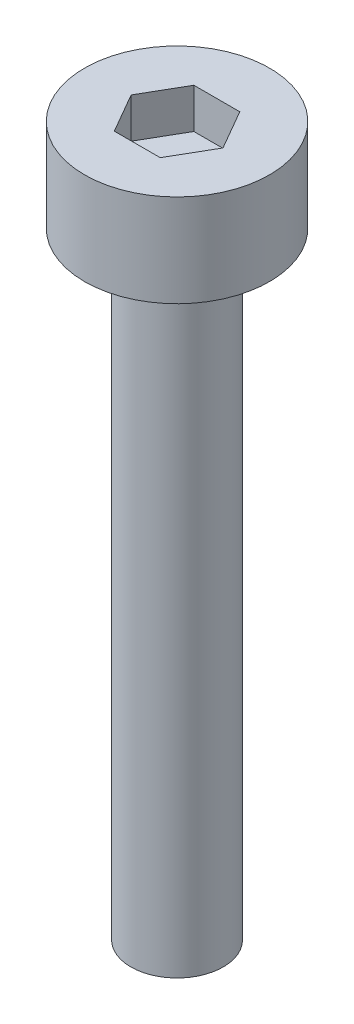
ISO-10303-21;
HEADER;
FILE_DESCRIPTION(('STEP AP214'),'2;1');
FILE_NAME('part.step','',(''),(''),'','','');
FILE_SCHEMA(('AUTOMOTIVE_DESIGN { 1 0 10303 214 1 1 1 1 }'));
ENDSEC;
DATA;
#1=APPLICATION_CONTEXT('core data for automotive mechanical design processes');
#2=APPLICATION_PROTOCOL_DEFINITION('international standard','automotive_design',2000,#1);
#3=PRODUCT_CONTEXT('',#1,'mechanical');
#4=PRODUCT('Part','Part','',(#3));
#5=PRODUCT_RELATED_PRODUCT_CATEGORY('part','',(#4));
#6=PRODUCT_DEFINITION_FORMATION('','',#4);
#7=PRODUCT_DEFINITION_CONTEXT('part definition',#1,'design');
#8=PRODUCT_DEFINITION('design','',#6,#7);
#9=PRODUCT_DEFINITION_SHAPE('','',#8);
#10=(LENGTH_UNIT() NAMED_UNIT(*) SI_UNIT(.MILLI.,.METRE.));
#11=(NAMED_UNIT(*) PLANE_ANGLE_UNIT() SI_UNIT($,.RADIAN.));
#12=(NAMED_UNIT(*) SI_UNIT($,.STERADIAN.) SOLID_ANGLE_UNIT());
#13=UNCERTAINTY_MEASURE_WITH_UNIT(LENGTH_MEASURE(1.E-05),#10,'distance_accuracy_value','');
#14=(GEOMETRIC_REPRESENTATION_CONTEXT(3) GLOBAL_UNCERTAINTY_ASSIGNED_CONTEXT((#13)) GLOBAL_UNIT_ASSIGNED_CONTEXT((#10,
#11,#12)) REPRESENTATION_CONTEXT('',''));
#15=CARTESIAN_POINT('',(0.,0.,0.));
#16=DIRECTION('',(0.,0.,1.));
#17=DIRECTION('',(1.,0.,0.));
#18=AXIS2_PLACEMENT_3D('',#15,#16,#17);
#19=CARTESIAN_POINT('',(0.,20.,0.));
#20=DIRECTION('',(0.,-1.,0.));
#21=DIRECTION('',(0.,0.,-1.));
#22=AXIS2_PLACEMENT_3D('',#19,#20,#21);
#23=CYLINDRICAL_SURFACE('',#22,1.5);
#24=CARTESIAN_POINT('',(0.,20.,0.));
#25=DIRECTION('',(0.,1.,0.));
#26=DIRECTION('',(0.,0.,1.));
#27=AXIS2_PLACEMENT_3D('',#24,#25,#26);
#28=CIRCLE('',#27,1.5);
#29=CARTESIAN_POINT('',(0.,20.,1.5));
#30=VERTEX_POINT('',#29);
#31=EDGE_CURVE('E11',#30,#30,#28,.T.);
#32=ORIENTED_EDGE('',*,*,#31,.F.);
#33=EDGE_LOOP('',(#32));
#34=FACE_BOUND('',#33,.T.);
#35=CARTESIAN_POINT('',(0.,0.,0.));
#36=DIRECTION('',(0.,1.,0.));
#37=DIRECTION('',(0.,0.,1.));
#38=AXIS2_PLACEMENT_3D('',#35,#36,#37);
#39=CIRCLE('',#38,1.5);
#40=CARTESIAN_POINT('',(0.,0.,1.5));
#41=VERTEX_POINT('',#40);
#42=EDGE_CURVE('E36',#41,#41,#39,.T.);
#43=ORIENTED_EDGE('',*,*,#42,.T.);
#44=EDGE_LOOP('',(#43));
#45=FACE_BOUND('',#44,.T.);
#46=ADVANCED_FACE('F33',(#34,#45),#23,.T.);
#47=CARTESIAN_POINT('',(0.,0.,0.));
#48=DIRECTION('',(0.,1.,0.));
#49=DIRECTION('',(0.,0.,1.));
#50=AXIS2_PLACEMENT_3D('',#47,#48,#49);
#51=PLANE('',#50);
#52=ORIENTED_EDGE('',*,*,#42,.F.);
#53=EDGE_LOOP('',(#52));
#54=FACE_BOUND('',#53,.T.);
#55=ADVANCED_FACE('F164',(#54),#51,.F.);
#56=CARTESIAN_POINT('',(0.,23.,0.));
#57=DIRECTION('',(0.,-1.,0.));
#58=DIRECTION('',(0.,0.,-1.));
#59=AXIS2_PLACEMENT_3D('',#56,#57,#58);
#60=CYLINDRICAL_SURFACE('',#59,3.);
#61=CARTESIAN_POINT('',(0.,23.,0.));
#62=DIRECTION('',(0.,1.,0.));
#63=DIRECTION('',(0.,0.,1.));
#64=AXIS2_PLACEMENT_3D('',#61,#62,#63);
#65=CIRCLE('',#64,3.);
#66=CARTESIAN_POINT('',(0.,23.,3.));
#67=VERTEX_POINT('',#66);
#68=EDGE_CURVE('E140',#67,#67,#65,.T.);
#69=ORIENTED_EDGE('',*,*,#68,.F.);
#70=EDGE_LOOP('',(#69));
#71=FACE_BOUND('',#70,.T.);
#72=CARTESIAN_POINT('',(0.,20.,0.));
#73=DIRECTION('',(0.,1.,0.));
#74=DIRECTION('',(0.,0.,1.));
#75=AXIS2_PLACEMENT_3D('',#72,#73,#74);
#76=CIRCLE('',#75,3.);
#77=CARTESIAN_POINT('',(0.,20.,3.));
#78=VERTEX_POINT('',#77);
#79=EDGE_CURVE('E134',#78,#78,#76,.T.);
#80=ORIENTED_EDGE('',*,*,#79,.T.);
#81=EDGE_LOOP('',(#80));
#82=FACE_BOUND('',#81,.T.);
#83=ADVANCED_FACE('F146',(#71,#82),#60,.T.);
#84=CARTESIAN_POINT('',(0.,23.,0.));
#85=DIRECTION('',(0.,1.,0.));
#86=DIRECTION('',(0.,0.,1.));
#87=AXIS2_PLACEMENT_3D('',#84,#85,#86);
#88=PLANE('',#87);
#89=DIRECTION('',(0.5,0.,-0.866025403784439));
#90=VECTOR('',#89,1.);
#91=CARTESIAN_POINT('',(0.744781847254617,23.,1.29));
#92=LINE('',#91,#90);
#93=CARTESIAN_POINT('',(0.744781847254617,23.,1.29));
#94=VERTEX_POINT('',#93);
#95=CARTESIAN_POINT('',(1.48956369450923,23.,0.));
#96=VERTEX_POINT('',#95);
#97=EDGE_CURVE('E47',#94,#96,#92,.T.);
#98=ORIENTED_EDGE('',*,*,#97,.F.);
#99=DIRECTION('',(1.,0.,0.));
#100=VECTOR('',#99,1.);
#101=CARTESIAN_POINT('',(-0.744781847254617,23.,1.29));
#102=LINE('',#101,#100);
#103=CARTESIAN_POINT('',(-0.744781847254617,23.,1.29));
#104=VERTEX_POINT('',#103);
#105=EDGE_CURVE('E130',#104,#94,#102,.T.);
#106=ORIENTED_EDGE('',*,*,#105,.F.);
#107=DIRECTION('',(0.5,0.,0.866025403784439));
#108=VECTOR('',#107,1.);
#109=CARTESIAN_POINT('',(-1.48956369450923,23.,0.));
#110=LINE('',#109,#108);
#111=CARTESIAN_POINT('',(-1.48956369450923,23.,0.));
#112=VERTEX_POINT('',#111);
#113=EDGE_CURVE('E128',#112,#104,#110,.T.);
#114=ORIENTED_EDGE('',*,*,#113,.F.);
#115=DIRECTION('',(-0.5,0.,0.866025403784439));
#116=VECTOR('',#115,1.);
#117=CARTESIAN_POINT('',(-0.744781847254617,23.,-1.29));
#118=LINE('',#117,#116);
#119=CARTESIAN_POINT('',(-0.744781847254617,23.,-1.29));
#120=VERTEX_POINT('',#119);
#121=EDGE_CURVE('E95',#120,#112,#118,.T.);
#122=ORIENTED_EDGE('',*,*,#121,.F.);
#123=DIRECTION('',(-1.,0.,0.));
#124=VECTOR('',#123,1.);
#125=CARTESIAN_POINT('',(0.744781847254618,23.,-1.29));
#126=LINE('',#125,#124);
#127=CARTESIAN_POINT('',(0.744781847254618,23.,-1.29));
#128=VERTEX_POINT('',#127);
#129=EDGE_CURVE('E124',#128,#120,#126,.T.);
#130=ORIENTED_EDGE('',*,*,#129,.F.);
#131=DIRECTION('',(-0.5,0.,-0.866025403784439));
#132=VECTOR('',#131,1.);
#133=CARTESIAN_POINT('',(1.48956369450923,23.,0.));
#134=LINE('',#133,#132);
#135=EDGE_CURVE('E121',#96,#128,#134,.T.);
#136=ORIENTED_EDGE('',*,*,#135,.F.);
#137=EDGE_LOOP('',(#98,#106,#114,#122,#130,#136));
#138=FACE_BOUND('',#137,.T.);
#139=ORIENTED_EDGE('',*,*,#68,.T.);
#140=EDGE_LOOP('',(#139));
#141=FACE_BOUND('',#140,.T.);
#142=ADVANCED_FACE('F151',(#138,#141),#88,.T.);
#143=CARTESIAN_POINT('',(0.,20.,0.));
#144=DIRECTION('',(0.,1.,0.));
#145=DIRECTION('',(0.,0.,1.));
#146=AXIS2_PLACEMENT_3D('',#143,#144,#145);
#147=PLANE('',#146);
#148=ORIENTED_EDGE('',*,*,#31,.T.);
#149=EDGE_LOOP('',(#148));
#150=FACE_BOUND('',#149,.T.);
#151=ORIENTED_EDGE('',*,*,#79,.F.);
#152=EDGE_LOOP('',(#151));
#153=FACE_BOUND('',#152,.T.);
#154=ADVANCED_FACE('F148',(#150,#153),#147,.F.);
#155=CARTESIAN_POINT('',(0.744781847254617,21.7,1.29));
#156=DIRECTION('',(0.866025403784439,0.,0.5));
#157=DIRECTION('',(0.5,0.,-0.866025403784439));
#158=AXIS2_PLACEMENT_3D('',#155,#156,#157);
#159=PLANE('',#158);
#160=ORIENTED_EDGE('',*,*,#97,.T.);
#161=DIRECTION('',(0.,1.,0.));
#162=VECTOR('',#161,1.);
#163=CARTESIAN_POINT('',(1.48956369450923,21.7,0.));
#164=LINE('',#163,#162);
#165=CARTESIAN_POINT('',(1.48956369450923,21.7,0.));
#166=VERTEX_POINT('',#165);
#167=EDGE_CURVE('E77',#166,#96,#164,.T.);
#168=ORIENTED_EDGE('',*,*,#167,.F.);
#169=DIRECTION('',(0.5,0.,-0.866025403784439));
#170=VECTOR('',#169,1.);
#171=CARTESIAN_POINT('',(0.744781847254617,21.7,1.29));
#172=LINE('',#171,#170);
#173=CARTESIAN_POINT('',(0.744781847254617,21.7,1.29));
#174=VERTEX_POINT('',#173);
#175=EDGE_CURVE('E132',#174,#166,#172,.T.);
#176=ORIENTED_EDGE('',*,*,#175,.F.);
#177=DIRECTION('',(0.,1.,0.));
#178=VECTOR('',#177,1.);
#179=CARTESIAN_POINT('',(0.744781847254617,21.7,1.29));
#180=LINE('',#179,#178);
#181=EDGE_CURVE('E55',#174,#94,#180,.T.);
#182=ORIENTED_EDGE('',*,*,#181,.T.);
#183=EDGE_LOOP('',(#160,#168,#176,#182));
#184=FACE_BOUND('',#183,.T.);
#185=ADVANCED_FACE('F150',(#184),#159,.F.);
#186=CARTESIAN_POINT('',(-0.744781847254617,21.7,1.29));
#187=DIRECTION('',(0.,0.,1.));
#188=DIRECTION('',(1.,0.,0.));
#189=AXIS2_PLACEMENT_3D('',#186,#187,#188);
#190=PLANE('',#189);
#191=ORIENTED_EDGE('',*,*,#105,.T.);
#192=ORIENTED_EDGE('',*,*,#181,.F.);
#193=DIRECTION('',(1.,0.,0.));
#194=VECTOR('',#193,1.);
#195=CARTESIAN_POINT('',(-0.744781847254617,21.7,1.29));
#196=LINE('',#195,#194);
#197=CARTESIAN_POINT('',(-0.744781847254617,21.7,1.29));
#198=VERTEX_POINT('',#197);
#199=EDGE_CURVE('E107',#198,#174,#196,.T.);
#200=ORIENTED_EDGE('',*,*,#199,.F.);
#201=DIRECTION('',(0.,1.,0.));
#202=VECTOR('',#201,1.);
#203=CARTESIAN_POINT('',(-0.744781847254617,21.7,1.29));
#204=LINE('',#203,#202);
#205=EDGE_CURVE('E99',#198,#104,#204,.T.);
#206=ORIENTED_EDGE('',*,*,#205,.T.);
#207=EDGE_LOOP('',(#191,#192,#200,#206));
#208=FACE_BOUND('',#207,.T.);
#209=ADVANCED_FACE('F158',(#208),#190,.F.);
#210=CARTESIAN_POINT('',(-1.48956369450923,21.7,0.));
#211=DIRECTION('',(-0.866025403784439,0.,0.5));
#212=DIRECTION('',(0.5,0.,0.866025403784439));
#213=AXIS2_PLACEMENT_3D('',#210,#211,#212);
#214=PLANE('',#213);
#215=ORIENTED_EDGE('',*,*,#113,.T.);
#216=ORIENTED_EDGE('',*,*,#205,.F.);
#217=DIRECTION('',(0.5,0.,0.866025403784439));
#218=VECTOR('',#217,1.);
#219=CARTESIAN_POINT('',(-1.48956369450923,21.7,0.));
#220=LINE('',#219,#218);
#221=CARTESIAN_POINT('',(-1.48956369450923,21.7,0.));
#222=VERTEX_POINT('',#221);
#223=EDGE_CURVE('E103',#222,#198,#220,.T.);
#224=ORIENTED_EDGE('',*,*,#223,.F.);
#225=DIRECTION('',(0.,1.,0.));
#226=VECTOR('',#225,1.);
#227=CARTESIAN_POINT('',(-1.48956369450923,21.7,0.));
#228=LINE('',#227,#226);
#229=EDGE_CURVE('E88',#222,#112,#228,.T.);
#230=ORIENTED_EDGE('',*,*,#229,.T.);
#231=EDGE_LOOP('',(#215,#216,#224,#230));
#232=FACE_BOUND('',#231,.T.);
#233=ADVANCED_FACE('F104',(#232),#214,.F.);
#234=CARTESIAN_POINT('',(-0.744781847254617,21.7,-1.29));
#235=DIRECTION('',(-0.866025403784439,0.,-0.5));
#236=DIRECTION('',(-0.5,0.,0.866025403784439));
#237=AXIS2_PLACEMENT_3D('',#234,#235,#236);
#238=PLANE('',#237);
#239=ORIENTED_EDGE('',*,*,#121,.T.);
#240=ORIENTED_EDGE('',*,*,#229,.F.);
#241=DIRECTION('',(-0.5,0.,0.866025403784439));
#242=VECTOR('',#241,1.);
#243=CARTESIAN_POINT('',(-0.744781847254617,21.7,-1.29));
#244=LINE('',#243,#242);
#245=CARTESIAN_POINT('',(-0.744781847254617,21.7,-1.29));
#246=VERTEX_POINT('',#245);
#247=EDGE_CURVE('E92',#246,#222,#244,.T.);
#248=ORIENTED_EDGE('',*,*,#247,.F.);
#249=DIRECTION('',(0.,1.,0.));
#250=VECTOR('',#249,1.);
#251=CARTESIAN_POINT('',(-0.744781847254617,21.7,-1.29));
#252=LINE('',#251,#250);
#253=EDGE_CURVE('E100',#246,#120,#252,.T.);
#254=ORIENTED_EDGE('',*,*,#253,.T.);
#255=EDGE_LOOP('',(#239,#240,#248,#254));
#256=FACE_BOUND('',#255,.T.);
#257=ADVANCED_FACE('F90',(#256),#238,.F.);
#258=CARTESIAN_POINT('',(0.744781847254618,21.7,-1.29));
#259=DIRECTION('',(0.,0.,-1.));
#260=DIRECTION('',(-1.,0.,0.));
#261=AXIS2_PLACEMENT_3D('',#258,#259,#260);
#262=PLANE('',#261);
#263=ORIENTED_EDGE('',*,*,#129,.T.);
#264=ORIENTED_EDGE('',*,*,#253,.F.);
#265=DIRECTION('',(-1.,0.,0.));
#266=VECTOR('',#265,1.);
#267=CARTESIAN_POINT('',(0.744781847254618,21.7,-1.29));
#268=LINE('',#267,#266);
#269=CARTESIAN_POINT('',(0.744781847254618,21.7,-1.29));
#270=VERTEX_POINT('',#269);
#271=EDGE_CURVE('E113',#270,#246,#268,.T.);
#272=ORIENTED_EDGE('',*,*,#271,.F.);
#273=DIRECTION('',(0.,1.,0.));
#274=VECTOR('',#273,1.);
#275=CARTESIAN_POINT('',(0.744781847254618,21.7,-1.29));
#276=LINE('',#275,#274);
#277=EDGE_CURVE('E137',#270,#128,#276,.T.);
#278=ORIENTED_EDGE('',*,*,#277,.T.);
#279=EDGE_LOOP('',(#263,#264,#272,#278));
#280=FACE_BOUND('',#279,.T.);
#281=ADVANCED_FACE('F219',(#280),#262,.F.);
#282=CARTESIAN_POINT('',(1.48956369450923,21.7,0.));
#283=DIRECTION('',(0.866025403784439,0.,-0.5));
#284=DIRECTION('',(-0.5,0.,-0.866025403784439));
#285=AXIS2_PLACEMENT_3D('',#282,#283,#284);
#286=PLANE('',#285);
#287=ORIENTED_EDGE('',*,*,#135,.T.);
#288=ORIENTED_EDGE('',*,*,#277,.F.);
#289=DIRECTION('',(-0.5,0.,-0.866025403784439));
#290=VECTOR('',#289,1.);
#291=CARTESIAN_POINT('',(1.48956369450923,21.7,0.));
#292=LINE('',#291,#290);
#293=EDGE_CURVE('E115',#166,#270,#292,.T.);
#294=ORIENTED_EDGE('',*,*,#293,.F.);
#295=ORIENTED_EDGE('',*,*,#167,.T.);
#296=EDGE_LOOP('',(#287,#288,#294,#295));
#297=FACE_BOUND('',#296,.T.);
#298=ADVANCED_FACE('F228',(#297),#286,.F.);
#299=CARTESIAN_POINT('',(0.,21.7,0.));
#300=DIRECTION('',(0.,1.,0.));
#301=DIRECTION('',(0.,0.,1.));
#302=AXIS2_PLACEMENT_3D('',#299,#300,#301);
#303=PLANE('',#302);
#304=ORIENTED_EDGE('',*,*,#175,.T.);
#305=ORIENTED_EDGE('',*,*,#293,.T.);
#306=ORIENTED_EDGE('',*,*,#271,.T.);
#307=ORIENTED_EDGE('',*,*,#247,.T.);
#308=ORIENTED_EDGE('',*,*,#223,.T.);
#309=ORIENTED_EDGE('',*,*,#199,.T.);
#310=EDGE_LOOP('',(#304,#305,#306,#307,#308,#309));
#311=FACE_BOUND('',#310,.T.);
#312=ADVANCED_FACE('F110',(#311),#303,.T.);
#313=CLOSED_SHELL('',(#46,#55,#83,#142,#154,#185,#209,#233,#257,#281,#298,#312));
#314=MANIFOLD_SOLID_BREP('B2',#313);
#315=ADVANCED_BREP_SHAPE_REPRESENTATION('',(#18,#314),#14);
#316=SHAPE_DEFINITION_REPRESENTATION(#9,#315);
ENDSEC;
END-ISO-10303-21;
